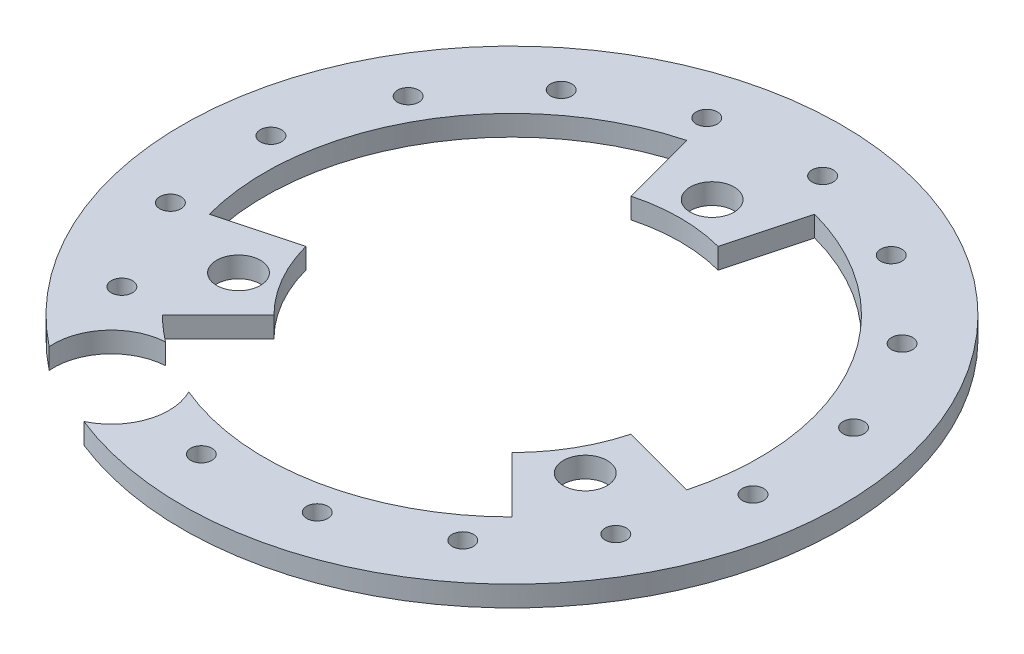
ISO-10303-21;
HEADER;
FILE_DESCRIPTION(('STEP AP214'),'2;1');
FILE_NAME('part.step','',(''),(''),'','','');
FILE_SCHEMA(('AUTOMOTIVE_DESIGN { 1 0 10303 214 1 1 1 1 }'));
ENDSEC;
DATA;
#1=APPLICATION_CONTEXT('core data for automotive mechanical design processes');
#2=APPLICATION_PROTOCOL_DEFINITION('international standard','automotive_design',2000,#1);
#3=PRODUCT_CONTEXT('',#1,'mechanical');
#4=PRODUCT('Part','Part','',(#3));
#5=PRODUCT_RELATED_PRODUCT_CATEGORY('part','',(#4));
#6=PRODUCT_DEFINITION_FORMATION('','',#4);
#7=PRODUCT_DEFINITION_CONTEXT('part definition',#1,'design');
#8=PRODUCT_DEFINITION('design','',#6,#7);
#9=PRODUCT_DEFINITION_SHAPE('','',#8);
#10=(LENGTH_UNIT() NAMED_UNIT(*) SI_UNIT(.MILLI.,.METRE.));
#11=(NAMED_UNIT(*) PLANE_ANGLE_UNIT() SI_UNIT($,.RADIAN.));
#12=(NAMED_UNIT(*) SI_UNIT($,.STERADIAN.) SOLID_ANGLE_UNIT());
#13=UNCERTAINTY_MEASURE_WITH_UNIT(LENGTH_MEASURE(1.E-05),#10,'distance_accuracy_value','');
#14=(GEOMETRIC_REPRESENTATION_CONTEXT(3) GLOBAL_UNCERTAINTY_ASSIGNED_CONTEXT((#13)) GLOBAL_UNIT_ASSIGNED_CONTEXT((#10,
#11,#12)) REPRESENTATION_CONTEXT('',''));
#15=CARTESIAN_POINT('',(0.,0.,0.));
#16=DIRECTION('',(0.,0.,1.));
#17=DIRECTION('',(1.,0.,0.));
#18=AXIS2_PLACEMENT_3D('',#15,#16,#17);
#19=CARTESIAN_POINT('',(0.,6.35,0.));
#20=DIRECTION('',(0.,-1.,0.));
#21=DIRECTION('',(0.,0.,-1.));
#22=AXIS2_PLACEMENT_3D('',#19,#20,#21);
#23=CYLINDRICAL_SURFACE('',#22,51.8922);
#24=CARTESIAN_POINT('',(0.,0.,0.));
#25=DIRECTION('',(0.,1.,0.));
#26=DIRECTION('',(0.,0.,1.));
#27=AXIS2_PLACEMENT_3D('',#24,#25,#26);
#28=CIRCLE('',#27,51.8922);
#29=CARTESIAN_POINT('',(13.430689652268,0.,-50.1240161629579));
#30=VERTEX_POINT('',#29);
#31=CARTESIAN_POINT('',(-13.4306896522687,0.,-50.1240161629577));
#32=VERTEX_POINT('',#31);
#33=EDGE_CURVE('E186',#30,#32,#28,.T.);
#34=ORIENTED_EDGE('',*,*,#33,.F.);
#35=DIRECTION('',(0.,-1.,0.));
#36=VECTOR('',#35,1.);
#37=CARTESIAN_POINT('',(13.430689652268,6.35,-50.1240161629579));
#38=LINE('',#37,#36);
#39=CARTESIAN_POINT('',(13.430689652268,6.35,-50.1240161629579));
#40=VERTEX_POINT('',#39);
#41=EDGE_CURVE('E47',#40,#30,#38,.T.);
#42=ORIENTED_EDGE('',*,*,#41,.F.);
#43=CARTESIAN_POINT('',(0.,6.35,0.));
#44=DIRECTION('',(0.,1.,0.));
#45=DIRECTION('',(0.,0.,1.));
#46=AXIS2_PLACEMENT_3D('',#43,#44,#45);
#47=CIRCLE('',#46,51.8922);
#48=CARTESIAN_POINT('',(-13.4306896522687,6.35,-50.1240161629577));
#49=VERTEX_POINT('',#48);
#50=EDGE_CURVE('E174',#40,#49,#47,.T.);
#51=ORIENTED_EDGE('',*,*,#50,.T.);
#52=DIRECTION('',(0.,-1.,0.));
#53=VECTOR('',#52,1.);
#54=CARTESIAN_POINT('',(-13.4306896522687,6.35,-50.1240161629577));
#55=LINE('',#54,#53);
#56=EDGE_CURVE('E345',#49,#32,#55,.T.);
#57=ORIENTED_EDGE('',*,*,#56,.T.);
#58=EDGE_LOOP('',(#34,#42,#51,#57));
#59=FACE_BOUND('',#58,.T.);
#60=ADVANCED_FACE('F30',(#59),#23,.F.);
#61=DIRECTION('',(0.,-1.,0.));
#62=VECTOR('',#61,1.);
#63=CARTESIAN_POINT('',(50.1240161629576,6.35,13.4306896522689));
#64=LINE('',#63,#62);
#65=CARTESIAN_POINT('',(50.1240161629576,6.35,13.4306896522689));
#66=VERTEX_POINT('',#65);
#67=CARTESIAN_POINT('',(50.1240161629576,0.,13.4306896522689));
#68=VERTEX_POINT('',#67);
#69=EDGE_CURVE('E146',#66,#68,#64,.T.);
#70=ORIENTED_EDGE('',*,*,#69,.T.);
#71=CARTESIAN_POINT('',(36.6933265106891,0.,36.693326510688));
#72=VERTEX_POINT('',#71);
#73=EDGE_CURVE('E185',#72,#68,#28,.T.);
#74=ORIENTED_EDGE('',*,*,#73,.F.);
#75=DIRECTION('',(0.,-1.,0.));
#76=VECTOR('',#75,1.);
#77=CARTESIAN_POINT('',(36.6933265106891,6.35,36.693326510688));
#78=LINE('',#77,#76);
#79=CARTESIAN_POINT('',(36.6933265106891,6.35,36.693326510688));
#80=VERTEX_POINT('',#79);
#81=EDGE_CURVE('E172',#80,#72,#78,.T.);
#82=ORIENTED_EDGE('',*,*,#81,.F.);
#83=EDGE_CURVE('E165',#80,#66,#47,.T.);
#84=ORIENTED_EDGE('',*,*,#83,.T.);
#85=EDGE_LOOP('',(#70,#74,#82,#84));
#86=FACE_BOUND('',#85,.T.);
#87=ADVANCED_FACE('F171',(#86),#23,.F.);
#88=CARTESIAN_POINT('',(-45.2120000000003,6.35,78.3094811118039));
#89=DIRECTION('',(0.,-1.,0.));
#90=DIRECTION('',(0.,0.,-1.));
#91=AXIS2_PLACEMENT_3D('',#88,#89,#90);
#92=CYLINDRICAL_SURFACE('',#91,17.78);
#93=CARTESIAN_POINT('',(-45.2120000000003,6.35,78.3094811118039));
#94=DIRECTION('',(0.,1.,0.));
#95=DIRECTION('',(0.,0.,1.));
#96=AXIS2_PLACEMENT_3D('',#93,#94,#95);
#97=CIRCLE('',#96,17.78);
#98=CARTESIAN_POINT('',(-37.6100895503124,6.35,94.3824197825924));
#99=VERTEX_POINT('',#98);
#100=CARTESIAN_POINT('',(-29.3218390263523,6.35,70.3325654026119));
#101=VERTEX_POINT('',#100);
#102=EDGE_CURVE('E349',#99,#101,#97,.T.);
#103=ORIENTED_EDGE('',*,*,#102,.T.);
#104=DIRECTION('',(0.,-1.,0.));
#105=VECTOR('',#104,1.);
#106=CARTESIAN_POINT('',(-29.3218390263523,3.175,70.3325654026119));
#107=LINE('',#106,#105);
#108=CARTESIAN_POINT('',(-29.3218390263523,0.,70.3325654026119));
#109=VERTEX_POINT('',#108);
#110=EDGE_CURVE('E11',#101,#109,#107,.T.);
#111=ORIENTED_EDGE('',*,*,#110,.T.);
#112=CARTESIAN_POINT('',(-45.2120000000003,0.,78.3094811118039));
#113=DIRECTION('',(0.,1.,0.));
#114=DIRECTION('',(0.,0.,1.));
#115=AXIS2_PLACEMENT_3D('',#112,#113,#114);
#116=CIRCLE('',#115,17.78);
#117=CARTESIAN_POINT('',(-37.6100895503124,0.,94.3824197825924));
#118=VERTEX_POINT('',#117);
#119=EDGE_CURVE('E354',#118,#109,#116,.T.);
#120=ORIENTED_EDGE('',*,*,#119,.F.);
#121=DIRECTION('',(0.,-1.,0.));
#122=VECTOR('',#121,1.);
#123=CARTESIAN_POINT('',(-37.6100895503124,3.175,94.3824197825924));
#124=LINE('',#123,#122);
#125=EDGE_CURVE('E190',#118,#99,#124,.F.);
#126=ORIENTED_EDGE('',*,*,#125,.T.);
#127=EDGE_LOOP('',(#103,#111,#120,#126));
#128=FACE_BOUND('',#127,.T.);
#129=ADVANCED_FACE('F396',(#128),#92,.F.);
#130=CARTESIAN_POINT('',(-46.2488688388167,0.,60.5597401838047));
#131=VERTEX_POINT('',#130);
#132=CARTESIAN_POINT('',(-62.9325284272163,0.,79.7625028804739));
#133=VERTEX_POINT('',#132);
#134=EDGE_CURVE('E348',#131,#133,#116,.T.);
#135=ORIENTED_EDGE('',*,*,#134,.F.);
#136=DIRECTION('',(0.,-1.,0.));
#137=VECTOR('',#136,1.);
#138=CARTESIAN_POINT('',(-46.2488688388167,3.175,60.5597401838047));
#139=LINE('',#138,#137);
#140=CARTESIAN_POINT('',(-46.2488688388167,6.35,60.5597401838047));
#141=VERTEX_POINT('',#140);
#142=EDGE_CURVE('E39',#131,#141,#139,.F.);
#143=ORIENTED_EDGE('',*,*,#142,.T.);
#144=CARTESIAN_POINT('',(-62.9325284272163,6.35,79.7625028804739));
#145=VERTEX_POINT('',#144);
#146=EDGE_CURVE('E353',#141,#145,#97,.T.);
#147=ORIENTED_EDGE('',*,*,#146,.T.);
#148=DIRECTION('',(0.,-1.,0.));
#149=VECTOR('',#148,1.);
#150=CARTESIAN_POINT('',(-62.9325284272163,3.175,79.762502880474));
#151=LINE('',#150,#149);
#152=EDGE_CURVE('E194',#145,#133,#151,.T.);
#153=ORIENTED_EDGE('',*,*,#152,.T.);
#154=EDGE_LOOP('',(#135,#143,#147,#153));
#155=FACE_BOUND('',#154,.T.);
#156=ADVANCED_FACE('F400',(#155),#92,.F.);
#157=CARTESIAN_POINT('',(0.,6.35,0.));
#158=DIRECTION('',(0.,1.,0.));
#159=DIRECTION('',(0.,0.,1.));
#160=AXIS2_PLACEMENT_3D('',#157,#158,#159);
#161=PLANE('',#160);
#162=CARTESIAN_POINT('',(67.7263259076391,6.35,-52.5539761012642));
#163=DIRECTION('',(0.,1.,0.));
#164=DIRECTION('',(0.,0.,1.));
#165=AXIS2_PLACEMENT_3D('',#162,#163,#164);
#166=CIRCLE('',#165,3.26389999999999);
#167=CARTESIAN_POINT('',(67.7263259076391,6.35,-49.2900761012642));
#168=VERTEX_POINT('',#167);
#169=EDGE_CURVE('E238',#168,#168,#166,.T.);
#170=ORIENTED_EDGE('',*,*,#169,.F.);
#171=EDGE_LOOP('',(#170));
#172=FACE_BOUND('',#171,.T.);
#173=CARTESIAN_POINT('',(82.6825022771214,6.35,-22.6358000122331));
#174=DIRECTION('',(0.,1.,0.));
#175=DIRECTION('',(0.,0.,1.));
#176=AXIS2_PLACEMENT_3D('',#173,#174,#175);
#177=CIRCLE('',#176,3.2639);
#178=CARTESIAN_POINT('',(82.6825022771214,6.35,-19.3719000122331));
#179=VERTEX_POINT('',#178);
#180=EDGE_CURVE('E227',#179,#179,#177,.T.);
#181=ORIENTED_EDGE('',*,*,#180,.F.);
#182=EDGE_LOOP('',(#181));
#183=FACE_BOUND('',#182,.T.);
#184=CARTESIAN_POINT('',(85.0510171936614,6.35,10.7284714346224));
#185=DIRECTION('',(0.,1.,0.));
#186=DIRECTION('',(0.,0.,1.));
#187=AXIS2_PLACEMENT_3D('',#184,#185,#186);
#188=CIRCLE('',#187,3.2639);
#189=CARTESIAN_POINT('',(85.0510171936614,6.35,13.9923714346224));
#190=VERTEX_POINT('',#189);
#191=EDGE_CURVE('E226',#190,#190,#188,.T.);
#192=ORIENTED_EDGE('',*,*,#191,.F.);
#193=EDGE_LOOP('',(#192));
#194=FACE_BOUND('',#193,.T.);
#195=CARTESIAN_POINT('',(74.4712857318572,6.35,42.4594303593922));
#196=DIRECTION('',(0.,1.,0.));
#197=DIRECTION('',(0.,0.,1.));
#198=AXIS2_PLACEMENT_3D('',#195,#196,#197);
#199=CIRCLE('',#198,3.2639);
#200=CARTESIAN_POINT('',(74.4712857318572,6.35,45.7233303593922));
#201=VERTEX_POINT('',#200);
#202=EDGE_CURVE('E243',#201,#201,#199,.T.);
#203=ORIENTED_EDGE('',*,*,#202,.F.);
#204=EDGE_LOOP('',(#203));
#205=FACE_BOUND('',#204,.T.);
#206=CARTESIAN_POINT('',(52.5539761012639,6.35,67.7263259076393));
#207=DIRECTION('',(0.,1.,0.));
#208=DIRECTION('',(0.,0.,1.));
#209=AXIS2_PLACEMENT_3D('',#206,#207,#208);
#210=CIRCLE('',#209,3.26389999999999);
#211=CARTESIAN_POINT('',(52.5539761012639,6.35,70.9902259076393));
#212=VERTEX_POINT('',#211);
#213=EDGE_CURVE('E223',#212,#212,#210,.T.);
#214=ORIENTED_EDGE('',*,*,#213,.F.);
#215=EDGE_LOOP('',(#214));
#216=FACE_BOUND('',#215,.T.);
#217=CARTESIAN_POINT('',(22.6358000122328,6.35,82.6825022771215));
#218=DIRECTION('',(0.,1.,0.));
#219=DIRECTION('',(0.,0.,1.));
#220=AXIS2_PLACEMENT_3D('',#217,#218,#219);
#221=CIRCLE('',#220,3.26389999999999);
#222=CARTESIAN_POINT('',(22.6358000122328,6.35,85.9464022771215));
#223=VERTEX_POINT('',#222);
#224=EDGE_CURVE('E222',#223,#223,#221,.T.);
#225=ORIENTED_EDGE('',*,*,#224,.F.);
#226=EDGE_LOOP('',(#225));
#227=FACE_BOUND('',#226,.T.);
#228=CARTESIAN_POINT('',(-10.7284714346226,6.35,85.0510171936614));
#229=DIRECTION('',(0.,1.,0.));
#230=DIRECTION('',(0.,0.,1.));
#231=AXIS2_PLACEMENT_3D('',#228,#229,#230);
#232=CIRCLE('',#231,3.26389999999999);
#233=CARTESIAN_POINT('',(-10.7284714346226,6.35,88.3149171936614));
#234=VERTEX_POINT('',#233);
#235=EDGE_CURVE('E219',#234,#234,#232,.T.);
#236=ORIENTED_EDGE('',*,*,#235,.F.);
#237=EDGE_LOOP('',(#236));
#238=FACE_BOUND('',#237,.T.);
#239=CARTESIAN_POINT('',(-67.7263259076395,6.35,52.5539761012637));
#240=DIRECTION('',(0.,1.,0.));
#241=DIRECTION('',(0.,0.,1.));
#242=AXIS2_PLACEMENT_3D('',#239,#240,#241);
#243=CIRCLE('',#242,3.26389999999999);
#244=CARTESIAN_POINT('',(-67.7263259076395,6.35,55.8178761012636));
#245=VERTEX_POINT('',#244);
#246=EDGE_CURVE('E218',#245,#245,#243,.T.);
#247=ORIENTED_EDGE('',*,*,#246,.F.);
#248=EDGE_LOOP('',(#247));
#249=FACE_BOUND('',#248,.T.);
#250=CARTESIAN_POINT('',(-82.6825022771215,6.35,22.6358000122326));
#251=DIRECTION('',(0.,1.,0.));
#252=DIRECTION('',(0.,0.,1.));
#253=AXIS2_PLACEMENT_3D('',#250,#251,#252);
#254=CIRCLE('',#253,3.26389999999999);
#255=CARTESIAN_POINT('',(-82.6825022771215,6.35,25.8997000122325));
#256=VERTEX_POINT('',#255);
#257=EDGE_CURVE('E263',#256,#256,#254,.T.);
#258=ORIENTED_EDGE('',*,*,#257,.F.);
#259=EDGE_LOOP('',(#258));
#260=FACE_BOUND('',#259,.T.);
#261=CARTESIAN_POINT('',(-85.0510171936614,6.35,-10.7284714346229));
#262=DIRECTION('',(0.,1.,0.));
#263=DIRECTION('',(0.,0.,1.));
#264=AXIS2_PLACEMENT_3D('',#261,#262,#263);
#265=CIRCLE('',#264,3.26389999999999);
#266=CARTESIAN_POINT('',(-85.0510171936614,6.35,-7.46457143462293));
#267=VERTEX_POINT('',#266);
#268=EDGE_CURVE('E214',#267,#267,#265,.T.);
#269=ORIENTED_EDGE('',*,*,#268,.F.);
#270=EDGE_LOOP('',(#269));
#271=FACE_BOUND('',#270,.T.);
#272=CARTESIAN_POINT('',(-74.4712857318569,6.35,-42.4594303593928));
#273=DIRECTION('',(0.,1.,0.));
#274=DIRECTION('',(0.,0.,1.));
#275=AXIS2_PLACEMENT_3D('',#272,#273,#274);
#276=CIRCLE('',#275,3.26389999999999);
#277=CARTESIAN_POINT('',(-74.4712857318569,6.35,-39.1955303593928));
#278=VERTEX_POINT('',#277);
#279=EDGE_CURVE('E210',#278,#278,#276,.T.);
#280=ORIENTED_EDGE('',*,*,#279,.F.);
#281=EDGE_LOOP('',(#280));
#282=FACE_BOUND('',#281,.T.);
#283=CARTESIAN_POINT('',(-52.5539761012634,6.35,-67.7263259076397));
#284=DIRECTION('',(0.,1.,0.));
#285=DIRECTION('',(0.,0.,1.));
#286=AXIS2_PLACEMENT_3D('',#283,#284,#285);
#287=CIRCLE('',#286,3.26389999999999);
#288=CARTESIAN_POINT('',(-52.5539761012634,6.35,-64.4624259076397));
#289=VERTEX_POINT('',#288);
#290=EDGE_CURVE('E209',#289,#289,#287,.T.);
#291=ORIENTED_EDGE('',*,*,#290,.F.);
#292=EDGE_LOOP('',(#291));
#293=FACE_BOUND('',#292,.T.);
#294=CARTESIAN_POINT('',(-22.6358000122323,6.35,-82.6825022771216));
#295=DIRECTION('',(0.,1.,0.));
#296=DIRECTION('',(0.,0.,1.));
#297=AXIS2_PLACEMENT_3D('',#294,#295,#296);
#298=CIRCLE('',#297,3.26389999999999);
#299=CARTESIAN_POINT('',(-22.6358000122323,6.35,-79.4186022771216));
#300=VERTEX_POINT('',#299);
#301=EDGE_CURVE('E278',#300,#300,#298,.T.);
#302=ORIENTED_EDGE('',*,*,#301,.F.);
#303=EDGE_LOOP('',(#302));
#304=FACE_BOUND('',#303,.T.);
#305=CARTESIAN_POINT('',(10.7284714346232,6.35,-85.0510171936613));
#306=DIRECTION('',(0.,1.,0.));
#307=DIRECTION('',(0.,0.,1.));
#308=AXIS2_PLACEMENT_3D('',#305,#306,#307);
#309=CIRCLE('',#308,3.26389999999999);
#310=CARTESIAN_POINT('',(10.7284714346232,6.35,-81.7871171936613));
#311=VERTEX_POINT('',#310);
#312=EDGE_CURVE('E205',#311,#311,#309,.T.);
#313=ORIENTED_EDGE('',*,*,#312,.F.);
#314=EDGE_LOOP('',(#313));
#315=FACE_BOUND('',#314,.T.);
#316=CARTESIAN_POINT('',(42.459430359393,6.35,-74.4712857318568));
#317=DIRECTION('',(0.,1.,0.));
#318=DIRECTION('',(0.,0.,1.));
#319=AXIS2_PLACEMENT_3D('',#316,#317,#318);
#320=CIRCLE('',#319,3.26389999999999);
#321=CARTESIAN_POINT('',(42.459430359393,6.35,-71.2073857318568));
#322=VERTEX_POINT('',#321);
#323=EDGE_CURVE('E201',#322,#322,#320,.T.);
#324=ORIENTED_EDGE('',*,*,#323,.F.);
#325=EDGE_LOOP('',(#324));
#326=FACE_BOUND('',#325,.T.);
#327=DIRECTION('',(-0.965925826289069,0.,-0.258819045102518));
#328=VECTOR('',#327,1.);
#329=CARTESIAN_POINT('',(54.6372965361038,6.35,14.6400194834686));
#330=LINE('',#329,#328);
#331=CARTESIAN_POINT('',(73.6035479632271,6.35,19.7220112368119));
#332=VERTEX_POINT('',#331);
#333=EDGE_CURVE('E149',#332,#66,#330,.T.);
#334=ORIENTED_EDGE('',*,*,#333,.T.);
#335=ORIENTED_EDGE('',*,*,#83,.F.);
#336=DIRECTION('',(-0.707106781186559,0.,-0.707106781186537));
#337=VECTOR('',#336,1.);
#338=CARTESIAN_POINT('',(90.8844637846029,6.35,90.8844637846));
#339=LINE('',#338,#337);
#340=CARTESIAN_POINT('',(53.8815367264158,6.35,53.8815367264141));
#341=VERTEX_POINT('',#340);
#342=EDGE_CURVE('E306',#341,#80,#339,.T.);
#343=ORIENTED_EDGE('',*,*,#342,.F.);
#344=CARTESIAN_POINT('',(0.,6.35,0.));
#345=DIRECTION('',(0.,1.,0.));
#346=DIRECTION('',(0.866025403784436,0.,-0.500000000000004));
#347=AXIS2_PLACEMENT_3D('',#344,#345,#346);
#348=CIRCLE('',#347,76.2);
#349=EDGE_CURVE('E303',#101,#341,#348,.T.);
#350=ORIENTED_EDGE('',*,*,#349,.F.);
#351=ORIENTED_EDGE('',*,*,#102,.F.);
#352=CARTESIAN_POINT('',(0.,6.35,0.));
#353=DIRECTION('',(0.,1.,0.));
#354=DIRECTION('',(0.,0.,1.));
#355=AXIS2_PLACEMENT_3D('',#352,#353,#354);
#356=CIRCLE('',#355,101.6);
#357=EDGE_CURVE('E187',#99,#145,#356,.T.);
#358=ORIENTED_EDGE('',*,*,#357,.T.);
#359=ORIENTED_EDGE('',*,*,#146,.F.);
#360=CARTESIAN_POINT('',(-53.881536726415,6.35,53.8815367264148));
#361=VERTEX_POINT('',#360);
#362=EDGE_CURVE('E55',#361,#141,#348,.T.);
#363=ORIENTED_EDGE('',*,*,#362,.F.);
#364=DIRECTION('',(0.707106781186549,0.,-0.707106781186546));
#365=VECTOR('',#364,1.);
#366=CARTESIAN_POINT('',(-39.997277052635,6.35,39.9972770526349));
#367=LINE('',#366,#365);
#368=CARTESIAN_POINT('',(-36.6933265106886,6.35,36.6933265106885));
#369=VERTEX_POINT('',#368);
#370=EDGE_CURVE('E300',#361,#369,#367,.T.);
#371=ORIENTED_EDGE('',*,*,#370,.T.);
#372=CARTESIAN_POINT('',(-50.1240161629574,6.35,13.4306896522696));
#373=VERTEX_POINT('',#372);
#374=EDGE_CURVE('E173',#373,#369,#47,.T.);
#375=ORIENTED_EDGE('',*,*,#374,.F.);
#376=DIRECTION('',(0.965925826289065,0.,-0.258819045102532));
#377=VECTOR('',#376,1.);
#378=CARTESIAN_POINT('',(-124.150486339092,6.35,33.2660225544923));
#379=LINE('',#378,#377);
#380=CARTESIAN_POINT('',(-73.6035479632268,6.35,19.7220112368129));
#381=VERTEX_POINT('',#380);
#382=EDGE_CURVE('E330',#381,#373,#379,.T.);
#383=ORIENTED_EDGE('',*,*,#382,.F.);
#384=CARTESIAN_POINT('',(0.,6.35,0.));
#385=DIRECTION('',(0.,1.,0.));
#386=DIRECTION('',(0.,0.,1.));
#387=AXIS2_PLACEMENT_3D('',#384,#385,#386);
#388=CIRCLE('',#387,76.2);
#389=CARTESIAN_POINT('',(-19.7220112368116,6.35,-73.6035479632271));
#390=VERTEX_POINT('',#389);
#391=EDGE_CURVE('E327',#390,#381,#388,.T.);
#392=ORIENTED_EDGE('',*,*,#391,.F.);
#393=DIRECTION('',(0.258819045102515,0.,0.96592582628907));
#394=VECTOR('',#393,1.);
#395=CARTESIAN_POINT('',(-14.6400194834684,6.35,-54.6372965361038));
#396=LINE('',#395,#394);
#397=EDGE_CURVE('E324',#390,#49,#396,.T.);
#398=ORIENTED_EDGE('',*,*,#397,.T.);
#399=ORIENTED_EDGE('',*,*,#50,.F.);
#400=DIRECTION('',(-0.258819045102501,0.,0.965925826289074));
#401=VECTOR('',#400,1.);
#402=CARTESIAN_POINT('',(33.2660225544884,6.35,-124.150486339093));
#403=LINE('',#402,#401);
#404=CARTESIAN_POINT('',(19.7220112368106,6.35,-73.6035479632274));
#405=VERTEX_POINT('',#404);
#406=EDGE_CURVE('E289',#405,#40,#403,.T.);
#407=ORIENTED_EDGE('',*,*,#406,.F.);
#408=CARTESIAN_POINT('',(0.,6.35,0.));
#409=DIRECTION('',(0.,1.,0.));
#410=DIRECTION('',(-0.866025403784443,0.,-0.499999999999992));
#411=AXIS2_PLACEMENT_3D('',#408,#409,#410);
#412=CIRCLE('',#411,76.2);
#413=EDGE_CURVE('E167',#332,#405,#412,.T.);
#414=ORIENTED_EDGE('',*,*,#413,.F.);
#415=EDGE_LOOP('',(#334,#335,#343,#350,#351,#358,#359,#363,#371,#375,#383,#392,#398,#399,#407,#414));
#416=FACE_BOUND('',#415,.T.);
#417=CARTESIAN_POINT('',(53.4528199723834,6.35,30.8609999999995));
#418=DIRECTION('',(0.,1.,0.));
#419=DIRECTION('',(-0.866025403784443,0.,-0.499999999999992));
#420=AXIS2_PLACEMENT_3D('',#417,#418,#419);
#421=CIRCLE('',#420,6.746875);
#422=CARTESIAN_POINT('',(47.6098548262252,6.35,27.4875624999996));
#423=VERTEX_POINT('',#422);
#424=EDGE_CURVE('E357',#423,#423,#421,.T.);
#425=ORIENTED_EDGE('',*,*,#424,.F.);
#426=EDGE_LOOP('',(#425));
#427=FACE_BOUND('',#426,.T.);
#428=CARTESIAN_POINT('',(0.,6.35,-61.722));
#429=DIRECTION('',(0.,1.,0.));
#430=DIRECTION('',(0.,0.,1.));
#431=AXIS2_PLACEMENT_3D('',#428,#429,#430);
#432=CIRCLE('',#431,6.746875);
#433=CARTESIAN_POINT('',(0.,6.35,-54.975125));
#434=VERTEX_POINT('',#433);
#435=EDGE_CURVE('E367',#434,#434,#432,.T.);
#436=ORIENTED_EDGE('',*,*,#435,.F.);
#437=EDGE_LOOP('',(#436));
#438=FACE_BOUND('',#437,.T.);
#439=CARTESIAN_POINT('',(-53.452819972383,6.35,30.8610000000003));
#440=DIRECTION('',(0.,1.,0.));
#441=DIRECTION('',(0.866025403784436,0.,-0.500000000000004));
#442=AXIS2_PLACEMENT_3D('',#439,#440,#441);
#443=CIRCLE('',#442,6.746875);
#444=CARTESIAN_POINT('',(-47.6098548262249,6.35,27.4875625000002));
#445=VERTEX_POINT('',#444);
#446=EDGE_CURVE('E363',#445,#445,#443,.T.);
#447=ORIENTED_EDGE('',*,*,#446,.F.);
#448=EDGE_LOOP('',(#447));
#449=FACE_BOUND('',#448,.T.);
#450=ADVANCED_FACE('F162',(#172,#183,#194,#205,#216,#227,#238,#249,#260,#271,#282,#293,#304,
#315,#326,#416,#427,#438,#449),#161,.T.);
#451=CARTESIAN_POINT('',(0.,0.,0.));
#452=DIRECTION('',(0.,1.,0.));
#453=DIRECTION('',(0.,0.,1.));
#454=AXIS2_PLACEMENT_3D('',#451,#452,#453);
#455=PLANE('',#454);
#456=CARTESIAN_POINT('',(67.7263259076391,0.,-52.5539761012642));
#457=DIRECTION('',(0.,1.,0.));
#458=DIRECTION('',(0.,0.,1.));
#459=AXIS2_PLACEMENT_3D('',#456,#457,#458);
#460=CIRCLE('',#459,3.26389999999999);
#461=CARTESIAN_POINT('',(67.7263259076391,0.,-49.2900761012642));
#462=VERTEX_POINT('',#461);
#463=EDGE_CURVE('E34',#462,#462,#460,.T.);
#464=ORIENTED_EDGE('',*,*,#463,.T.);
#465=EDGE_LOOP('',(#464));
#466=FACE_BOUND('',#465,.T.);
#467=CARTESIAN_POINT('',(82.6825022771214,0.,-22.6358000122331));
#468=DIRECTION('',(0.,1.,0.));
#469=DIRECTION('',(0.,0.,1.));
#470=AXIS2_PLACEMENT_3D('',#467,#468,#469);
#471=CIRCLE('',#470,3.26389999999999);
#472=CARTESIAN_POINT('',(82.6825022771214,0.,-19.3719000122331));
#473=VERTEX_POINT('',#472);
#474=EDGE_CURVE('E224',#473,#473,#471,.T.);
#475=ORIENTED_EDGE('',*,*,#474,.T.);
#476=EDGE_LOOP('',(#475));
#477=FACE_BOUND('',#476,.T.);
#478=CARTESIAN_POINT('',(85.0510171936614,0.,10.7284714346224));
#479=DIRECTION('',(0.,1.,0.));
#480=DIRECTION('',(0.,0.,1.));
#481=AXIS2_PLACEMENT_3D('',#478,#479,#480);
#482=CIRCLE('',#481,3.26389999999999);
#483=CARTESIAN_POINT('',(85.0510171936614,0.,13.9923714346223));
#484=VERTEX_POINT('',#483);
#485=EDGE_CURVE('E231',#484,#484,#482,.T.);
#486=ORIENTED_EDGE('',*,*,#485,.T.);
#487=EDGE_LOOP('',(#486));
#488=FACE_BOUND('',#487,.T.);
#489=CARTESIAN_POINT('',(74.4712857318572,0.,42.4594303593922));
#490=DIRECTION('',(0.,1.,0.));
#491=DIRECTION('',(0.,0.,1.));
#492=AXIS2_PLACEMENT_3D('',#489,#490,#491);
#493=CIRCLE('',#492,3.26389999999999);
#494=CARTESIAN_POINT('',(74.4712857318572,0.,45.7233303593922));
#495=VERTEX_POINT('',#494);
#496=EDGE_CURVE('E246',#495,#495,#493,.T.);
#497=ORIENTED_EDGE('',*,*,#496,.T.);
#498=EDGE_LOOP('',(#497));
#499=FACE_BOUND('',#498,.T.);
#500=CARTESIAN_POINT('',(52.5539761012639,0.,67.7263259076393));
#501=DIRECTION('',(0.,1.,0.));
#502=DIRECTION('',(0.,0.,1.));
#503=AXIS2_PLACEMENT_3D('',#500,#501,#502);
#504=CIRCLE('',#503,3.26389999999999);
#505=CARTESIAN_POINT('',(52.5539761012639,0.,70.9902259076393));
#506=VERTEX_POINT('',#505);
#507=EDGE_CURVE('E220',#506,#506,#504,.T.);
#508=ORIENTED_EDGE('',*,*,#507,.T.);
#509=EDGE_LOOP('',(#508));
#510=FACE_BOUND('',#509,.T.);
#511=CARTESIAN_POINT('',(22.6358000122328,0.,82.6825022771215));
#512=DIRECTION('',(0.,1.,0.));
#513=DIRECTION('',(0.,0.,1.));
#514=AXIS2_PLACEMENT_3D('',#511,#512,#513);
#515=CIRCLE('',#514,3.26389999999999);
#516=CARTESIAN_POINT('',(22.6358000122328,0.,85.9464022771215));
#517=VERTEX_POINT('',#516);
#518=EDGE_CURVE('E253',#517,#517,#515,.T.);
#519=ORIENTED_EDGE('',*,*,#518,.T.);
#520=EDGE_LOOP('',(#519));
#521=FACE_BOUND('',#520,.T.);
#522=CARTESIAN_POINT('',(-10.7284714346226,0.,85.0510171936614));
#523=DIRECTION('',(0.,1.,0.));
#524=DIRECTION('',(0.,0.,1.));
#525=AXIS2_PLACEMENT_3D('',#522,#523,#524);
#526=CIRCLE('',#525,3.26389999999999);
#527=CARTESIAN_POINT('',(-10.7284714346226,0.,88.3149171936614));
#528=VERTEX_POINT('',#527);
#529=EDGE_CURVE('E215',#528,#528,#526,.T.);
#530=ORIENTED_EDGE('',*,*,#529,.T.);
#531=EDGE_LOOP('',(#530));
#532=FACE_BOUND('',#531,.T.);
#533=CARTESIAN_POINT('',(-67.7263259076395,0.,52.5539761012637));
#534=DIRECTION('',(0.,1.,0.));
#535=DIRECTION('',(0.,0.,1.));
#536=AXIS2_PLACEMENT_3D('',#533,#534,#535);
#537=CIRCLE('',#536,3.26389999999999);
#538=CARTESIAN_POINT('',(-67.7263259076395,0.,55.8178761012636));
#539=VERTEX_POINT('',#538);
#540=EDGE_CURVE('E260',#539,#539,#537,.T.);
#541=ORIENTED_EDGE('',*,*,#540,.T.);
#542=EDGE_LOOP('',(#541));
#543=FACE_BOUND('',#542,.T.);
#544=CARTESIAN_POINT('',(-82.6825022771215,0.,22.6358000122326));
#545=DIRECTION('',(0.,1.,0.));
#546=DIRECTION('',(0.,0.,1.));
#547=AXIS2_PLACEMENT_3D('',#544,#545,#546);
#548=CIRCLE('',#547,3.26389999999999);
#549=CARTESIAN_POINT('',(-82.6825022771215,0.,25.8997000122325));
#550=VERTEX_POINT('',#549);
#551=EDGE_CURVE('E266',#550,#550,#548,.T.);
#552=ORIENTED_EDGE('',*,*,#551,.T.);
#553=EDGE_LOOP('',(#552));
#554=FACE_BOUND('',#553,.T.);
#555=CARTESIAN_POINT('',(-85.0510171936614,0.,-10.7284714346229));
#556=DIRECTION('',(0.,1.,0.));
#557=DIRECTION('',(0.,0.,1.));
#558=AXIS2_PLACEMENT_3D('',#555,#556,#557);
#559=CIRCLE('',#558,3.26389999999999);
#560=CARTESIAN_POINT('',(-85.0510171936614,0.,-7.46457143462293));
#561=VERTEX_POINT('',#560);
#562=EDGE_CURVE('E211',#561,#561,#559,.T.);
#563=ORIENTED_EDGE('',*,*,#562,.T.);
#564=EDGE_LOOP('',(#563));
#565=FACE_BOUND('',#564,.T.);
#566=CARTESIAN_POINT('',(-74.4712857318569,0.,-42.4594303593928));
#567=DIRECTION('',(0.,1.,0.));
#568=DIRECTION('',(0.,0.,1.));
#569=AXIS2_PLACEMENT_3D('',#566,#567,#568);
#570=CIRCLE('',#569,3.26389999999999);
#571=CARTESIAN_POINT('',(-74.4712857318569,0.,-39.1955303593928));
#572=VERTEX_POINT('',#571);
#573=EDGE_CURVE('E206',#572,#572,#570,.T.);
#574=ORIENTED_EDGE('',*,*,#573,.T.);
#575=EDGE_LOOP('',(#574));
#576=FACE_BOUND('',#575,.T.);
#577=CARTESIAN_POINT('',(-52.5539761012634,0.,-67.7263259076397));
#578=DIRECTION('',(0.,1.,0.));
#579=DIRECTION('',(0.,0.,1.));
#580=AXIS2_PLACEMENT_3D('',#577,#578,#579);
#581=CIRCLE('',#580,3.26389999999999);
#582=CARTESIAN_POINT('',(-52.5539761012634,0.,-64.4624259076397));
#583=VERTEX_POINT('',#582);
#584=EDGE_CURVE('E275',#583,#583,#581,.T.);
#585=ORIENTED_EDGE('',*,*,#584,.T.);
#586=EDGE_LOOP('',(#585));
#587=FACE_BOUND('',#586,.T.);
#588=CARTESIAN_POINT('',(-22.6358000122323,0.,-82.6825022771216));
#589=DIRECTION('',(0.,1.,0.));
#590=DIRECTION('',(0.,0.,1.));
#591=AXIS2_PLACEMENT_3D('',#588,#589,#590);
#592=CIRCLE('',#591,3.26389999999999);
#593=CARTESIAN_POINT('',(-22.6358000122323,0.,-79.4186022771216));
#594=VERTEX_POINT('',#593);
#595=EDGE_CURVE('E281',#594,#594,#592,.T.);
#596=ORIENTED_EDGE('',*,*,#595,.T.);
#597=EDGE_LOOP('',(#596));
#598=FACE_BOUND('',#597,.T.);
#599=CARTESIAN_POINT('',(10.7284714346232,0.,-85.0510171936613));
#600=DIRECTION('',(0.,1.,0.));
#601=DIRECTION('',(0.,0.,1.));
#602=AXIS2_PLACEMENT_3D('',#599,#600,#601);
#603=CIRCLE('',#602,3.26389999999999);
#604=CARTESIAN_POINT('',(10.7284714346232,0.,-81.7871171936613));
#605=VERTEX_POINT('',#604);
#606=EDGE_CURVE('E202',#605,#605,#603,.T.);
#607=ORIENTED_EDGE('',*,*,#606,.T.);
#608=EDGE_LOOP('',(#607));
#609=FACE_BOUND('',#608,.T.);
#610=CARTESIAN_POINT('',(42.459430359393,0.,-74.4712857318568));
#611=DIRECTION('',(0.,1.,0.));
#612=DIRECTION('',(0.,0.,1.));
#613=AXIS2_PLACEMENT_3D('',#610,#611,#612);
#614=CIRCLE('',#613,3.26389999999999);
#615=CARTESIAN_POINT('',(42.459430359393,0.,-71.2073857318568));
#616=VERTEX_POINT('',#615);
#617=EDGE_CURVE('E198',#616,#616,#614,.T.);
#618=ORIENTED_EDGE('',*,*,#617,.T.);
#619=EDGE_LOOP('',(#618));
#620=FACE_BOUND('',#619,.T.);
#621=CARTESIAN_POINT('',(53.4528199723834,0.,30.8609999999995));
#622=DIRECTION('',(0.,1.,0.));
#623=DIRECTION('',(-0.866025403784443,0.,-0.499999999999992));
#624=AXIS2_PLACEMENT_3D('',#621,#622,#623);
#625=CIRCLE('',#624,6.746875);
#626=CARTESIAN_POINT('',(47.6098548262252,0.,27.4875624999996));
#627=VERTEX_POINT('',#626);
#628=EDGE_CURVE('E352',#627,#627,#625,.T.);
#629=ORIENTED_EDGE('',*,*,#628,.T.);
#630=EDGE_LOOP('',(#629));
#631=FACE_BOUND('',#630,.T.);
#632=CARTESIAN_POINT('',(0.,0.,-61.722));
#633=DIRECTION('',(0.,1.,0.));
#634=DIRECTION('',(0.,0.,1.));
#635=AXIS2_PLACEMENT_3D('',#632,#633,#634);
#636=CIRCLE('',#635,6.746875);
#637=CARTESIAN_POINT('',(0.,0.,-54.975125));
#638=VERTEX_POINT('',#637);
#639=EDGE_CURVE('E181',#638,#638,#636,.T.);
#640=ORIENTED_EDGE('',*,*,#639,.T.);
#641=EDGE_LOOP('',(#640));
#642=FACE_BOUND('',#641,.T.);
#643=ORIENTED_EDGE('',*,*,#73,.T.);
#644=DIRECTION('',(-0.965925826289069,0.,-0.258819045102518));
#645=VECTOR('',#644,1.);
#646=CARTESIAN_POINT('',(54.6372965361038,0.,14.6400194834686));
#647=LINE('',#646,#645);
#648=CARTESIAN_POINT('',(73.6035479632271,0.,19.7220112368119));
#649=VERTEX_POINT('',#648);
#650=EDGE_CURVE('E152',#649,#68,#647,.T.);
#651=ORIENTED_EDGE('',*,*,#650,.F.);
#652=CARTESIAN_POINT('',(0.,0.,0.));
#653=DIRECTION('',(0.,1.,0.));
#654=DIRECTION('',(-0.866025403784443,0.,-0.499999999999992));
#655=AXIS2_PLACEMENT_3D('',#652,#653,#654);
#656=CIRCLE('',#655,76.2);
#657=CARTESIAN_POINT('',(19.7220112368106,0.,-73.6035479632274));
#658=VERTEX_POINT('',#657);
#659=EDGE_CURVE('E292',#649,#658,#656,.T.);
#660=ORIENTED_EDGE('',*,*,#659,.T.);
#661=DIRECTION('',(-0.258819045102501,0.,0.965925826289074));
#662=VECTOR('',#661,1.);
#663=CARTESIAN_POINT('',(33.2660225544884,0.,-124.150486339093));
#664=LINE('',#663,#662);
#665=EDGE_CURVE('E168',#658,#30,#664,.T.);
#666=ORIENTED_EDGE('',*,*,#665,.T.);
#667=ORIENTED_EDGE('',*,*,#33,.T.);
#668=DIRECTION('',(0.258819045102515,0.,0.96592582628907));
#669=VECTOR('',#668,1.);
#670=CARTESIAN_POINT('',(-14.6400194834684,0.,-54.6372965361038));
#671=LINE('',#670,#669);
#672=CARTESIAN_POINT('',(-19.7220112368116,0.,-73.6035479632271));
#673=VERTEX_POINT('',#672);
#674=EDGE_CURVE('E323',#673,#32,#671,.T.);
#675=ORIENTED_EDGE('',*,*,#674,.F.);
#676=CARTESIAN_POINT('',(0.,0.,0.));
#677=DIRECTION('',(0.,1.,0.));
#678=DIRECTION('',(0.,0.,1.));
#679=AXIS2_PLACEMENT_3D('',#676,#677,#678);
#680=CIRCLE('',#679,76.2);
#681=CARTESIAN_POINT('',(-73.6035479632268,0.,19.7220112368129));
#682=VERTEX_POINT('',#681);
#683=EDGE_CURVE('E335',#673,#682,#680,.T.);
#684=ORIENTED_EDGE('',*,*,#683,.T.);
#685=DIRECTION('',(0.965925826289065,0.,-0.258819045102532));
#686=VECTOR('',#685,1.);
#687=CARTESIAN_POINT('',(-124.150486339092,0.,33.2660225544923));
#688=LINE('',#687,#686);
#689=CARTESIAN_POINT('',(-50.1240161629574,0.,13.4306896522696));
#690=VERTEX_POINT('',#689);
#691=EDGE_CURVE('E328',#682,#690,#688,.T.);
#692=ORIENTED_EDGE('',*,*,#691,.T.);
#693=CARTESIAN_POINT('',(-36.6933265106886,0.,36.6933265106885));
#694=VERTEX_POINT('',#693);
#695=EDGE_CURVE('E178',#690,#694,#28,.T.);
#696=ORIENTED_EDGE('',*,*,#695,.T.);
#697=DIRECTION('',(0.707106781186549,0.,-0.707106781186546));
#698=VECTOR('',#697,1.);
#699=CARTESIAN_POINT('',(-39.997277052635,0.,39.9972770526349));
#700=LINE('',#699,#698);
#701=CARTESIAN_POINT('',(-53.881536726415,0.,53.8815367264148));
#702=VERTEX_POINT('',#701);
#703=EDGE_CURVE('E157',#702,#694,#700,.T.);
#704=ORIENTED_EDGE('',*,*,#703,.F.);
#705=CARTESIAN_POINT('',(0.,0.,0.));
#706=DIRECTION('',(0.,1.,0.));
#707=DIRECTION('',(0.866025403784436,0.,-0.500000000000004));
#708=AXIS2_PLACEMENT_3D('',#705,#706,#707);
#709=CIRCLE('',#708,76.2);
#710=EDGE_CURVE('E310',#702,#131,#709,.T.);
#711=ORIENTED_EDGE('',*,*,#710,.T.);
#712=ORIENTED_EDGE('',*,*,#134,.T.);
#713=CARTESIAN_POINT('',(0.,0.,0.));
#714=DIRECTION('',(0.,1.,0.));
#715=DIRECTION('',(0.,0.,1.));
#716=AXIS2_PLACEMENT_3D('',#713,#714,#715);
#717=CIRCLE('',#716,101.6);
#718=EDGE_CURVE('E177',#118,#133,#717,.T.);
#719=ORIENTED_EDGE('',*,*,#718,.F.);
#720=ORIENTED_EDGE('',*,*,#119,.T.);
#721=CARTESIAN_POINT('',(53.8815367264158,0.,53.8815367264141));
#722=VERTEX_POINT('',#721);
#723=EDGE_CURVE('E309',#109,#722,#709,.T.);
#724=ORIENTED_EDGE('',*,*,#723,.T.);
#725=DIRECTION('',(-0.707106781186559,0.,-0.707106781186537));
#726=VECTOR('',#725,1.);
#727=CARTESIAN_POINT('',(90.8844637846029,0.,90.8844637846));
#728=LINE('',#727,#726);
#729=EDGE_CURVE('E304',#722,#72,#728,.T.);
#730=ORIENTED_EDGE('',*,*,#729,.T.);
#731=EDGE_LOOP('',(#643,#651,#660,#666,#667,#675,#684,#692,#696,#704,#711,#712,#719,#720,#724,#730));
#732=FACE_BOUND('',#731,.T.);
#733=CARTESIAN_POINT('',(-53.452819972383,0.,30.8610000000003));
#734=DIRECTION('',(0.,1.,0.));
#735=DIRECTION('',(0.866025403784436,0.,-0.500000000000004));
#736=AXIS2_PLACEMENT_3D('',#733,#734,#735);
#737=CIRCLE('',#736,6.746875);
#738=CARTESIAN_POINT('',(-47.6098548262249,0.,27.4875625000002));
#739=VERTEX_POINT('',#738);
#740=EDGE_CURVE('E360',#739,#739,#737,.T.);
#741=ORIENTED_EDGE('',*,*,#740,.T.);
#742=EDGE_LOOP('',(#741));
#743=FACE_BOUND('',#742,.T.);
#744=ADVANCED_FACE('F374',(#466,#477,#488,#499,#510,#521,#532,#543,#554,#565,#576,#587,#598,
#609,#620,#631,#642,#732,#743),#455,.F.);
#745=CARTESIAN_POINT('',(0.,6.35,0.));
#746=DIRECTION('',(0.,-1.,0.));
#747=DIRECTION('',(0.,0.,-1.));
#748=AXIS2_PLACEMENT_3D('',#745,#746,#747);
#749=CYLINDRICAL_SURFACE('',#748,101.6);
#750=ORIENTED_EDGE('',*,*,#152,.F.);
#751=ORIENTED_EDGE('',*,*,#357,.F.);
#752=ORIENTED_EDGE('',*,*,#125,.F.);
#753=ORIENTED_EDGE('',*,*,#718,.T.);
#754=EDGE_LOOP('',(#750,#751,#752,#753));
#755=FACE_BOUND('',#754,.T.);
#756=ADVANCED_FACE('F32',(#755),#749,.T.);
#757=DIRECTION('',(0.,-1.,0.));
#758=VECTOR('',#757,1.);
#759=CARTESIAN_POINT('',(-36.6933265106886,6.35,36.6933265106885));
#760=LINE('',#759,#758);
#761=EDGE_CURVE('E320',#369,#694,#760,.T.);
#762=ORIENTED_EDGE('',*,*,#761,.T.);
#763=ORIENTED_EDGE('',*,*,#695,.F.);
#764=DIRECTION('',(0.,-1.,0.));
#765=VECTOR('',#764,1.);
#766=CARTESIAN_POINT('',(-50.1240161629574,6.35,13.4306896522696));
#767=LINE('',#766,#765);
#768=EDGE_CURVE('E332',#373,#690,#767,.T.);
#769=ORIENTED_EDGE('',*,*,#768,.F.);
#770=ORIENTED_EDGE('',*,*,#374,.T.);
#771=EDGE_LOOP('',(#762,#763,#769,#770));
#772=FACE_BOUND('',#771,.T.);
#773=ADVANCED_FACE('F380',(#772),#23,.F.);
#774=CARTESIAN_POINT('',(0.,6.35,-61.722));
#775=DIRECTION('',(0.,-1.,0.));
#776=DIRECTION('',(0.,0.,-1.));
#777=AXIS2_PLACEMENT_3D('',#774,#775,#776);
#778=CYLINDRICAL_SURFACE('',#777,6.746875);
#779=ORIENTED_EDGE('',*,*,#435,.T.);
#780=EDGE_LOOP('',(#779));
#781=FACE_BOUND('',#780,.T.);
#782=ORIENTED_EDGE('',*,*,#639,.F.);
#783=EDGE_LOOP('',(#782));
#784=FACE_BOUND('',#783,.T.);
#785=ADVANCED_FACE('F377',(#781,#784),#778,.F.);
#786=CARTESIAN_POINT('',(-53.452819972383,6.35,30.8610000000003));
#787=DIRECTION('',(0.,-1.,0.));
#788=DIRECTION('',(0.,0.,-1.));
#789=AXIS2_PLACEMENT_3D('',#786,#787,#788);
#790=CYLINDRICAL_SURFACE('',#789,6.746875);
#791=ORIENTED_EDGE('',*,*,#446,.T.);
#792=EDGE_LOOP('',(#791));
#793=FACE_BOUND('',#792,.T.);
#794=ORIENTED_EDGE('',*,*,#740,.F.);
#795=EDGE_LOOP('',(#794));
#796=FACE_BOUND('',#795,.T.);
#797=ADVANCED_FACE('F379',(#793,#796),#790,.F.);
#798=CARTESIAN_POINT('',(53.4528199723834,6.35,30.8609999999995));
#799=DIRECTION('',(0.,-1.,0.));
#800=DIRECTION('',(0.,0.,-1.));
#801=AXIS2_PLACEMENT_3D('',#798,#799,#800);
#802=CYLINDRICAL_SURFACE('',#801,6.746875);
#803=ORIENTED_EDGE('',*,*,#424,.T.);
#804=EDGE_LOOP('',(#803));
#805=FACE_BOUND('',#804,.T.);
#806=ORIENTED_EDGE('',*,*,#628,.F.);
#807=EDGE_LOOP('',(#806));
#808=FACE_BOUND('',#807,.T.);
#809=ADVANCED_FACE('F386',(#805,#808),#802,.F.);
#810=CARTESIAN_POINT('',(-14.6400194834684,6.35,-54.6372965361038));
#811=DIRECTION('',(0.96592582628907,0.,-0.258819045102515));
#812=DIRECTION('',(-0.258819045102515,0.,-0.96592582628907));
#813=AXIS2_PLACEMENT_3D('',#810,#811,#812);
#814=PLANE('',#813);
#815=ORIENTED_EDGE('',*,*,#674,.T.);
#816=ORIENTED_EDGE('',*,*,#56,.F.);
#817=ORIENTED_EDGE('',*,*,#397,.F.);
#818=DIRECTION('',(0.,-1.,0.));
#819=VECTOR('',#818,1.);
#820=CARTESIAN_POINT('',(-19.7220112368116,6.35,-73.6035479632271));
#821=LINE('',#820,#819);
#822=EDGE_CURVE('E343',#390,#673,#821,.T.);
#823=ORIENTED_EDGE('',*,*,#822,.T.);
#824=EDGE_LOOP('',(#815,#816,#817,#823));
#825=FACE_BOUND('',#824,.T.);
#826=ADVANCED_FACE('F439',(#825),#814,.F.);
#827=CARTESIAN_POINT('',(0.,6.35,0.));
#828=DIRECTION('',(0.,-1.,0.));
#829=DIRECTION('',(0.,0.,-1.));
#830=AXIS2_PLACEMENT_3D('',#827,#828,#829);
#831=CYLINDRICAL_SURFACE('',#830,76.2);
#832=ORIENTED_EDGE('',*,*,#683,.F.);
#833=ORIENTED_EDGE('',*,*,#822,.F.);
#834=ORIENTED_EDGE('',*,*,#391,.T.);
#835=DIRECTION('',(0.,-1.,0.));
#836=VECTOR('',#835,1.);
#837=CARTESIAN_POINT('',(-73.6035479632268,6.35,19.7220112368129));
#838=LINE('',#837,#836);
#839=EDGE_CURVE('E341',#381,#682,#838,.T.);
#840=ORIENTED_EDGE('',*,*,#839,.T.);
#841=EDGE_LOOP('',(#832,#833,#834,#840));
#842=FACE_BOUND('',#841,.T.);
#843=ADVANCED_FACE('F445',(#842),#831,.F.);
#844=CARTESIAN_POINT('',(-124.150486339092,6.35,33.2660225544923));
#845=DIRECTION('',(-0.258819045102532,0.,-0.965925826289065));
#846=DIRECTION('',(-0.965925826289066,0.,0.258819045102532));
#847=AXIS2_PLACEMENT_3D('',#844,#845,#846);
#848=PLANE('',#847);
#849=ORIENTED_EDGE('',*,*,#691,.F.);
#850=ORIENTED_EDGE('',*,*,#839,.F.);
#851=ORIENTED_EDGE('',*,*,#382,.T.);
#852=ORIENTED_EDGE('',*,*,#768,.T.);
#853=EDGE_LOOP('',(#849,#850,#851,#852));
#854=FACE_BOUND('',#853,.T.);
#855=ADVANCED_FACE('F454',(#854),#848,.T.);
#856=CARTESIAN_POINT('',(0.,6.35,0.));
#857=DIRECTION('',(0.,-1.,0.));
#858=DIRECTION('',(0.,0.,-1.));
#859=AXIS2_PLACEMENT_3D('',#856,#857,#858);
#860=CYLINDRICAL_SURFACE('',#859,76.2);
#861=ORIENTED_EDGE('',*,*,#710,.F.);
#862=DIRECTION('',(0.,-1.,0.));
#863=VECTOR('',#862,1.);
#864=CARTESIAN_POINT('',(-53.881536726415,6.35,53.8815367264148));
#865=LINE('',#864,#863);
#866=EDGE_CURVE('E318',#361,#702,#865,.T.);
#867=ORIENTED_EDGE('',*,*,#866,.F.);
#868=ORIENTED_EDGE('',*,*,#362,.T.);
#869=ORIENTED_EDGE('',*,*,#142,.F.);
#870=EDGE_LOOP('',(#861,#867,#868,#869));
#871=FACE_BOUND('',#870,.T.);
#872=ADVANCED_FACE('F458',(#871),#860,.F.);
#873=CARTESIAN_POINT('',(-39.997277052635,6.35,39.9972770526349));
#874=DIRECTION('',(-0.707106781186546,0.,-0.707106781186549));
#875=DIRECTION('',(-0.707106781186549,0.,0.707106781186546));
#876=AXIS2_PLACEMENT_3D('',#873,#874,#875);
#877=PLANE('',#876);
#878=ORIENTED_EDGE('',*,*,#703,.T.);
#879=ORIENTED_EDGE('',*,*,#761,.F.);
#880=ORIENTED_EDGE('',*,*,#370,.F.);
#881=ORIENTED_EDGE('',*,*,#866,.T.);
#882=EDGE_LOOP('',(#878,#879,#880,#881));
#883=FACE_BOUND('',#882,.T.);
#884=ADVANCED_FACE('F460',(#883),#877,.F.);
#885=ORIENTED_EDGE('',*,*,#349,.T.);
#886=DIRECTION('',(0.,-1.,0.));
#887=VECTOR('',#886,1.);
#888=CARTESIAN_POINT('',(53.8815367264158,6.35,53.8815367264141));
#889=LINE('',#888,#887);
#890=EDGE_CURVE('E316',#341,#722,#889,.T.);
#891=ORIENTED_EDGE('',*,*,#890,.T.);
#892=ORIENTED_EDGE('',*,*,#723,.F.);
#893=ORIENTED_EDGE('',*,*,#110,.F.);
#894=EDGE_LOOP('',(#885,#891,#892,#893));
#895=FACE_BOUND('',#894,.T.);
#896=ADVANCED_FACE('F463',(#895),#860,.F.);
#897=CARTESIAN_POINT('',(90.8844637846029,6.35,90.8844637846));
#898=DIRECTION('',(-0.707106781186536,0.,0.707106781186559));
#899=DIRECTION('',(0.707106781186559,0.,0.707106781186536));
#900=AXIS2_PLACEMENT_3D('',#897,#898,#899);
#901=PLANE('',#900);
#902=ORIENTED_EDGE('',*,*,#729,.F.);
#903=ORIENTED_EDGE('',*,*,#890,.F.);
#904=ORIENTED_EDGE('',*,*,#342,.T.);
#905=ORIENTED_EDGE('',*,*,#81,.T.);
#906=EDGE_LOOP('',(#902,#903,#904,#905));
#907=FACE_BOUND('',#906,.T.);
#908=ADVANCED_FACE('F467',(#907),#901,.T.);
#909=CARTESIAN_POINT('',(54.6372965361038,6.35,14.6400194834686));
#910=DIRECTION('',(-0.258819045102518,0.,0.965925826289069));
#911=DIRECTION('',(0.965925826289069,0.,0.258819045102518));
#912=AXIS2_PLACEMENT_3D('',#909,#910,#911);
#913=PLANE('',#912);
#914=ORIENTED_EDGE('',*,*,#650,.T.);
#915=ORIENTED_EDGE('',*,*,#69,.F.);
#916=ORIENTED_EDGE('',*,*,#333,.F.);
#917=DIRECTION('',(0.,-1.,0.));
#918=VECTOR('',#917,1.);
#919=CARTESIAN_POINT('',(73.6035479632271,6.35,19.7220112368119));
#920=LINE('',#919,#918);
#921=EDGE_CURVE('E158',#332,#649,#920,.T.);
#922=ORIENTED_EDGE('',*,*,#921,.T.);
#923=EDGE_LOOP('',(#914,#915,#916,#922));
#924=FACE_BOUND('',#923,.T.);
#925=ADVANCED_FACE('F148',(#924),#913,.F.);
#926=CARTESIAN_POINT('',(0.,6.35,0.));
#927=DIRECTION('',(0.,-1.,0.));
#928=DIRECTION('',(0.,0.,-1.));
#929=AXIS2_PLACEMENT_3D('',#926,#927,#928);
#930=CYLINDRICAL_SURFACE('',#929,76.2);
#931=ORIENTED_EDGE('',*,*,#659,.F.);
#932=ORIENTED_EDGE('',*,*,#921,.F.);
#933=ORIENTED_EDGE('',*,*,#413,.T.);
#934=DIRECTION('',(0.,-1.,0.));
#935=VECTOR('',#934,1.);
#936=CARTESIAN_POINT('',(19.7220112368106,6.35,-73.6035479632274));
#937=LINE('',#936,#935);
#938=EDGE_CURVE('E297',#405,#658,#937,.T.);
#939=ORIENTED_EDGE('',*,*,#938,.T.);
#940=EDGE_LOOP('',(#931,#932,#933,#939));
#941=FACE_BOUND('',#940,.T.);
#942=ADVANCED_FACE('F473',(#941),#930,.F.);
#943=CARTESIAN_POINT('',(33.2660225544884,6.35,-124.150486339093));
#944=DIRECTION('',(0.965925826289074,0.,0.258819045102501));
#945=DIRECTION('',(0.258819045102501,0.,-0.965925826289074));
#946=AXIS2_PLACEMENT_3D('',#943,#944,#945);
#947=PLANE('',#946);
#948=ORIENTED_EDGE('',*,*,#665,.F.);
#949=ORIENTED_EDGE('',*,*,#938,.F.);
#950=ORIENTED_EDGE('',*,*,#406,.T.);
#951=ORIENTED_EDGE('',*,*,#41,.T.);
#952=EDGE_LOOP('',(#948,#949,#950,#951));
#953=FACE_BOUND('',#952,.T.);
#954=ADVANCED_FACE('F476',(#953),#947,.T.);
#955=CARTESIAN_POINT('',(42.459430359393,6.35,-74.4712857318568));
#956=DIRECTION('',(0.,1.,0.));
#957=DIRECTION('',(0.,0.,1.));
#958=AXIS2_PLACEMENT_3D('',#955,#956,#957);
#959=CYLINDRICAL_SURFACE('',#958,3.26389999999999);
#960=ORIENTED_EDGE('',*,*,#323,.T.);
#961=EDGE_LOOP('',(#960));
#962=FACE_BOUND('',#961,.T.);
#963=ORIENTED_EDGE('',*,*,#617,.F.);
#964=EDGE_LOOP('',(#963));
#965=FACE_BOUND('',#964,.T.);
#966=ADVANCED_FACE('F480',(#962,#965),#959,.F.);
#967=CARTESIAN_POINT('',(10.7284714346232,6.35,-85.0510171936613));
#968=DIRECTION('',(0.,1.,0.));
#969=DIRECTION('',(0.,0.,1.));
#970=AXIS2_PLACEMENT_3D('',#967,#968,#969);
#971=CYLINDRICAL_SURFACE('',#970,3.26389999999999);
#972=ORIENTED_EDGE('',*,*,#312,.T.);
#973=EDGE_LOOP('',(#972));
#974=FACE_BOUND('',#973,.T.);
#975=ORIENTED_EDGE('',*,*,#606,.F.);
#976=EDGE_LOOP('',(#975));
#977=FACE_BOUND('',#976,.T.);
#978=ADVANCED_FACE('F483',(#974,#977),#971,.F.);
#979=CARTESIAN_POINT('',(-22.6358000122323,6.35,-82.6825022771216));
#980=DIRECTION('',(0.,1.,0.));
#981=DIRECTION('',(0.,0.,1.));
#982=AXIS2_PLACEMENT_3D('',#979,#980,#981);
#983=CYLINDRICAL_SURFACE('',#982,3.26389999999999);
#984=ORIENTED_EDGE('',*,*,#301,.T.);
#985=EDGE_LOOP('',(#984));
#986=FACE_BOUND('',#985,.T.);
#987=ORIENTED_EDGE('',*,*,#595,.F.);
#988=EDGE_LOOP('',(#987));
#989=FACE_BOUND('',#988,.T.);
#990=ADVANCED_FACE('F487',(#986,#989),#983,.F.);
#991=CARTESIAN_POINT('',(-52.5539761012634,6.35,-67.7263259076397));
#992=DIRECTION('',(0.,1.,0.));
#993=DIRECTION('',(0.,0.,1.));
#994=AXIS2_PLACEMENT_3D('',#991,#992,#993);
#995=CYLINDRICAL_SURFACE('',#994,3.26389999999999);
#996=ORIENTED_EDGE('',*,*,#290,.T.);
#997=EDGE_LOOP('',(#996));
#998=FACE_BOUND('',#997,.T.);
#999=ORIENTED_EDGE('',*,*,#584,.F.);
#1000=EDGE_LOOP('',(#999));
#1001=FACE_BOUND('',#1000,.T.);
#1002=ADVANCED_FACE('F491',(#998,#1001),#995,.F.);
#1003=CARTESIAN_POINT('',(-74.4712857318569,6.35,-42.4594303593928));
#1004=DIRECTION('',(0.,1.,0.));
#1005=DIRECTION('',(0.,0.,1.));
#1006=AXIS2_PLACEMENT_3D('',#1003,#1004,#1005);
#1007=CYLINDRICAL_SURFACE('',#1006,3.26389999999999);
#1008=ORIENTED_EDGE('',*,*,#279,.T.);
#1009=EDGE_LOOP('',(#1008));
#1010=FACE_BOUND('',#1009,.T.);
#1011=ORIENTED_EDGE('',*,*,#573,.F.);
#1012=EDGE_LOOP('',(#1011));
#1013=FACE_BOUND('',#1012,.T.);
#1014=ADVANCED_FACE('F495',(#1010,#1013),#1007,.F.);
#1015=CARTESIAN_POINT('',(-85.0510171936614,6.35,-10.7284714346229));
#1016=DIRECTION('',(0.,1.,0.));
#1017=DIRECTION('',(0.,0.,1.));
#1018=AXIS2_PLACEMENT_3D('',#1015,#1016,#1017);
#1019=CYLINDRICAL_SURFACE('',#1018,3.26389999999999);
#1020=ORIENTED_EDGE('',*,*,#268,.T.);
#1021=EDGE_LOOP('',(#1020));
#1022=FACE_BOUND('',#1021,.T.);
#1023=ORIENTED_EDGE('',*,*,#562,.F.);
#1024=EDGE_LOOP('',(#1023));
#1025=FACE_BOUND('',#1024,.T.);
#1026=ADVANCED_FACE('F499',(#1022,#1025),#1019,.F.);
#1027=CARTESIAN_POINT('',(-82.6825022771215,6.35,22.6358000122326));
#1028=DIRECTION('',(0.,1.,0.));
#1029=DIRECTION('',(0.,0.,1.));
#1030=AXIS2_PLACEMENT_3D('',#1027,#1028,#1029);
#1031=CYLINDRICAL_SURFACE('',#1030,3.26389999999999);
#1032=ORIENTED_EDGE('',*,*,#257,.T.);
#1033=EDGE_LOOP('',(#1032));
#1034=FACE_BOUND('',#1033,.T.);
#1035=ORIENTED_EDGE('',*,*,#551,.F.);
#1036=EDGE_LOOP('',(#1035));
#1037=FACE_BOUND('',#1036,.T.);
#1038=ADVANCED_FACE('F503',(#1034,#1037),#1031,.F.);
#1039=CARTESIAN_POINT('',(-67.7263259076395,6.35,52.5539761012637));
#1040=DIRECTION('',(0.,1.,0.));
#1041=DIRECTION('',(0.,0.,1.));
#1042=AXIS2_PLACEMENT_3D('',#1039,#1040,#1041);
#1043=CYLINDRICAL_SURFACE('',#1042,3.26389999999999);
#1044=ORIENTED_EDGE('',*,*,#246,.T.);
#1045=EDGE_LOOP('',(#1044));
#1046=FACE_BOUND('',#1045,.T.);
#1047=ORIENTED_EDGE('',*,*,#540,.F.);
#1048=EDGE_LOOP('',(#1047));
#1049=FACE_BOUND('',#1048,.T.);
#1050=ADVANCED_FACE('F507',(#1046,#1049),#1043,.F.);
#1051=CARTESIAN_POINT('',(-10.7284714346226,6.35,85.0510171936614));
#1052=DIRECTION('',(0.,1.,0.));
#1053=DIRECTION('',(0.,0.,1.));
#1054=AXIS2_PLACEMENT_3D('',#1051,#1052,#1053);
#1055=CYLINDRICAL_SURFACE('',#1054,3.26389999999999);
#1056=ORIENTED_EDGE('',*,*,#235,.T.);
#1057=EDGE_LOOP('',(#1056));
#1058=FACE_BOUND('',#1057,.T.);
#1059=ORIENTED_EDGE('',*,*,#529,.F.);
#1060=EDGE_LOOP('',(#1059));
#1061=FACE_BOUND('',#1060,.T.);
#1062=ADVANCED_FACE('F511',(#1058,#1061),#1055,.F.);
#1063=CARTESIAN_POINT('',(22.6358000122328,6.35,82.6825022771215));
#1064=DIRECTION('',(0.,1.,0.));
#1065=DIRECTION('',(0.,0.,1.));
#1066=AXIS2_PLACEMENT_3D('',#1063,#1064,#1065);
#1067=CYLINDRICAL_SURFACE('',#1066,3.26389999999999);
#1068=ORIENTED_EDGE('',*,*,#224,.T.);
#1069=EDGE_LOOP('',(#1068));
#1070=FACE_BOUND('',#1069,.T.);
#1071=ORIENTED_EDGE('',*,*,#518,.F.);
#1072=EDGE_LOOP('',(#1071));
#1073=FACE_BOUND('',#1072,.T.);
#1074=ADVANCED_FACE('F515',(#1070,#1073),#1067,.F.);
#1075=CARTESIAN_POINT('',(52.5539761012639,6.35,67.7263259076393));
#1076=DIRECTION('',(0.,1.,0.));
#1077=DIRECTION('',(0.,0.,1.));
#1078=AXIS2_PLACEMENT_3D('',#1075,#1076,#1077);
#1079=CYLINDRICAL_SURFACE('',#1078,3.26389999999999);
#1080=ORIENTED_EDGE('',*,*,#213,.T.);
#1081=EDGE_LOOP('',(#1080));
#1082=FACE_BOUND('',#1081,.T.);
#1083=ORIENTED_EDGE('',*,*,#507,.F.);
#1084=EDGE_LOOP('',(#1083));
#1085=FACE_BOUND('',#1084,.T.);
#1086=ADVANCED_FACE('F519',(#1082,#1085),#1079,.F.);
#1087=CARTESIAN_POINT('',(74.4712857318572,6.35,42.4594303593922));
#1088=DIRECTION('',(0.,1.,0.));
#1089=DIRECTION('',(0.,0.,1.));
#1090=AXIS2_PLACEMENT_3D('',#1087,#1088,#1089);
#1091=CYLINDRICAL_SURFACE('',#1090,3.26389999999999);
#1092=ORIENTED_EDGE('',*,*,#202,.T.);
#1093=EDGE_LOOP('',(#1092));
#1094=FACE_BOUND('',#1093,.T.);
#1095=ORIENTED_EDGE('',*,*,#496,.F.);
#1096=EDGE_LOOP('',(#1095));
#1097=FACE_BOUND('',#1096,.T.);
#1098=ADVANCED_FACE('F523',(#1094,#1097),#1091,.F.);
#1099=CARTESIAN_POINT('',(85.0510171936614,6.35,10.7284714346224));
#1100=DIRECTION('',(0.,1.,0.));
#1101=DIRECTION('',(0.,0.,1.));
#1102=AXIS2_PLACEMENT_3D('',#1099,#1100,#1101);
#1103=CYLINDRICAL_SURFACE('',#1102,3.26389999999999);
#1104=ORIENTED_EDGE('',*,*,#191,.T.);
#1105=EDGE_LOOP('',(#1104));
#1106=FACE_BOUND('',#1105,.T.);
#1107=ORIENTED_EDGE('',*,*,#485,.F.);
#1108=EDGE_LOOP('',(#1107));
#1109=FACE_BOUND('',#1108,.T.);
#1110=ADVANCED_FACE('F527',(#1106,#1109),#1103,.F.);
#1111=CARTESIAN_POINT('',(82.6825022771214,6.35,-22.6358000122331));
#1112=DIRECTION('',(0.,1.,0.));
#1113=DIRECTION('',(0.,0.,1.));
#1114=AXIS2_PLACEMENT_3D('',#1111,#1112,#1113);
#1115=CYLINDRICAL_SURFACE('',#1114,3.26389999999999);
#1116=ORIENTED_EDGE('',*,*,#180,.T.);
#1117=EDGE_LOOP('',(#1116));
#1118=FACE_BOUND('',#1117,.T.);
#1119=ORIENTED_EDGE('',*,*,#474,.F.);
#1120=EDGE_LOOP('',(#1119));
#1121=FACE_BOUND('',#1120,.T.);
#1122=ADVANCED_FACE('F531',(#1118,#1121),#1115,.F.);
#1123=CARTESIAN_POINT('',(67.7263259076391,6.35,-52.5539761012642));
#1124=DIRECTION('',(0.,1.,0.));
#1125=DIRECTION('',(0.,0.,1.));
#1126=AXIS2_PLACEMENT_3D('',#1123,#1124,#1125);
#1127=CYLINDRICAL_SURFACE('',#1126,3.26389999999999);
#1128=ORIENTED_EDGE('',*,*,#169,.T.);
#1129=EDGE_LOOP('',(#1128));
#1130=FACE_BOUND('',#1129,.T.);
#1131=ORIENTED_EDGE('',*,*,#463,.F.);
#1132=EDGE_LOOP('',(#1131));
#1133=FACE_BOUND('',#1132,.T.);
#1134=ADVANCED_FACE('F535',(#1130,#1133),#1127,.F.);
#1135=CLOSED_SHELL('',(#60,#87,#129,#156,#450,#744,#756,#773,#785,#797,#809,#826,#843,#855,#872,
#884,#896,#908,#925,#942,#954,#966,#978,#990,#1002,#1014,#1026,#1038,#1050,#1062,#1074,#1086,
#1098,#1110,#1122,#1134));
#1136=MANIFOLD_SOLID_BREP('B2',#1135);
#1137=ADVANCED_BREP_SHAPE_REPRESENTATION('',(#18,#1136),#14);
#1138=SHAPE_DEFINITION_REPRESENTATION(#9,#1137);
ENDSEC;
END-ISO-10303-21;
